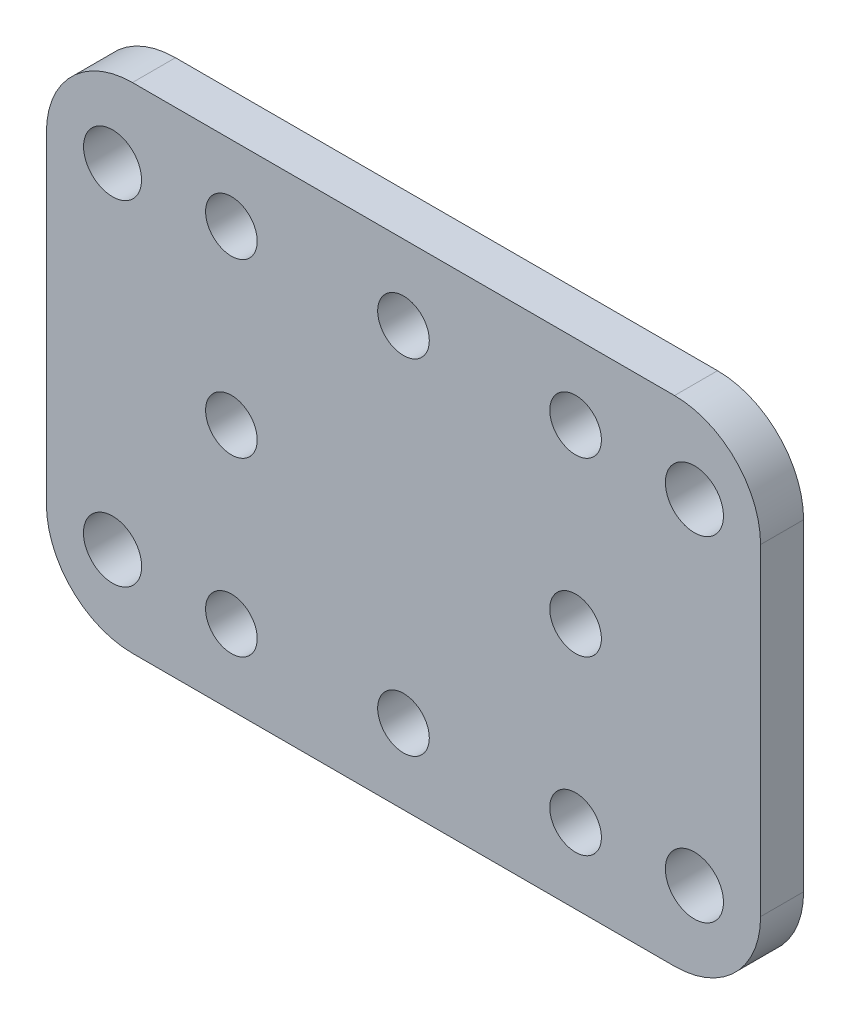
ISO-10303-21;
HEADER;
FILE_DESCRIPTION(('STEP AP214'),'2;1');
FILE_NAME('part.step','',(''),(''),'','','');
FILE_SCHEMA(('AUTOMOTIVE_DESIGN { 1 0 10303 214 1 1 1 1 }'));
ENDSEC;
DATA;
#1=APPLICATION_CONTEXT('core data for automotive mechanical design processes');
#2=APPLICATION_PROTOCOL_DEFINITION('international standard','automotive_design',2000,#1);
#3=PRODUCT_CONTEXT('',#1,'mechanical');
#4=PRODUCT('Part','Part','',(#3));
#5=PRODUCT_RELATED_PRODUCT_CATEGORY('part','',(#4));
#6=PRODUCT_DEFINITION_FORMATION('','',#4);
#7=PRODUCT_DEFINITION_CONTEXT('part definition',#1,'design');
#8=PRODUCT_DEFINITION('design','',#6,#7);
#9=PRODUCT_DEFINITION_SHAPE('','',#8);
#10=(LENGTH_UNIT() NAMED_UNIT(*) SI_UNIT(.MILLI.,.METRE.));
#11=(NAMED_UNIT(*) PLANE_ANGLE_UNIT() SI_UNIT($,.RADIAN.));
#12=(NAMED_UNIT(*) SI_UNIT($,.STERADIAN.) SOLID_ANGLE_UNIT());
#13=UNCERTAINTY_MEASURE_WITH_UNIT(LENGTH_MEASURE(1.E-05),#10,'distance_accuracy_value','');
#14=(GEOMETRIC_REPRESENTATION_CONTEXT(3) GLOBAL_UNCERTAINTY_ASSIGNED_CONTEXT((#13)) GLOBAL_UNIT_ASSIGNED_CONTEXT((#10,
#11,#12)) REPRESENTATION_CONTEXT('',''));
#15=CARTESIAN_POINT('',(0.,0.,0.));
#16=DIRECTION('',(0.,0.,1.));
#17=DIRECTION('',(1.,0.,0.));
#18=AXIS2_PLACEMENT_3D('',#15,#16,#17);
#19=CARTESIAN_POINT('',(-0.0106464534901096,23.1539046314824,2.));
#20=DIRECTION('',(1.,0.,0.));
#21=DIRECTION('',(0.,0.,-1.));
#22=AXIS2_PLACEMENT_3D('',#19,#20,#21);
#23=PLANE('',#22);
#24=DIRECTION('',(0.,-1.,0.));
#25=VECTOR('',#24,1.);
#26=CARTESIAN_POINT('',(-0.0106464534901096,23.1539046314824,0.));
#27=LINE('',#26,#25);
#28=CARTESIAN_POINT('',(-0.0106464534901096,19.1539046314824,0.));
#29=VERTEX_POINT('',#28);
#30=CARTESIAN_POINT('',(-0.0106464534901096,4.17558115471862,0.));
#31=VERTEX_POINT('',#30);
#32=EDGE_CURVE('E169',#29,#31,#27,.T.);
#33=ORIENTED_EDGE('',*,*,#32,.T.);
#34=DIRECTION('',(0.,0.,-1.));
#35=VECTOR('',#34,1.);
#36=CARTESIAN_POINT('',(-0.0106464534901096,4.17558115471862,2.));
#37=LINE('',#36,#35);
#38=CARTESIAN_POINT('',(-0.0106464534901096,4.17558115471862,2.));
#39=VERTEX_POINT('',#38);
#40=EDGE_CURVE('E54',#31,#39,#37,.F.);
#41=ORIENTED_EDGE('',*,*,#40,.T.);
#42=DIRECTION('',(0.,-1.,0.));
#43=VECTOR('',#42,1.);
#44=CARTESIAN_POINT('',(-0.0106464534901096,23.1539046314824,2.));
#45=LINE('',#44,#43);
#46=CARTESIAN_POINT('',(-0.0106464534901096,19.1539046314824,2.));
#47=VERTEX_POINT('',#46);
#48=EDGE_CURVE('E159',#47,#39,#45,.T.);
#49=ORIENTED_EDGE('',*,*,#48,.F.);
#50=DIRECTION('',(0.,0.,-1.));
#51=VECTOR('',#50,1.);
#52=CARTESIAN_POINT('',(-0.0106464534901096,19.1539046314824,0.));
#53=LINE('',#52,#51);
#54=EDGE_CURVE('E149',#47,#29,#53,.T.);
#55=ORIENTED_EDGE('',*,*,#54,.T.);
#56=EDGE_LOOP('',(#33,#41,#49,#55));
#57=FACE_BOUND('',#56,.T.);
#58=ADVANCED_FACE('F33',(#57),#23,.F.);
#59=CARTESIAN_POINT('',(-0.0106464534901096,0.175581154718624,2.));
#60=DIRECTION('',(0.,1.,0.));
#61=DIRECTION('',(0.,0.,1.));
#62=AXIS2_PLACEMENT_3D('',#59,#60,#61);
#63=PLANE('',#62);
#64=DIRECTION('',(1.,0.,0.));
#65=VECTOR('',#64,1.);
#66=CARTESIAN_POINT('',(-0.0106464534901096,0.175581154718624,2.));
#67=LINE('',#66,#65);
#68=CARTESIAN_POINT('',(3.98935354650989,0.175581154718624,2.));
#69=VERTEX_POINT('',#68);
#70=CARTESIAN_POINT('',(29.1903595716427,0.175581154718624,2.));
#71=VERTEX_POINT('',#70);
#72=EDGE_CURVE('E158',#69,#71,#67,.T.);
#73=ORIENTED_EDGE('',*,*,#72,.F.);
#74=DIRECTION('',(0.,0.,-1.));
#75=VECTOR('',#74,1.);
#76=CARTESIAN_POINT('',(3.98935354650989,0.175581154718624,2.));
#77=LINE('',#76,#75);
#78=CARTESIAN_POINT('',(3.98935354650989,0.175581154718624,0.));
#79=VERTEX_POINT('',#78);
#80=EDGE_CURVE('E142',#69,#79,#77,.T.);
#81=ORIENTED_EDGE('',*,*,#80,.T.);
#82=DIRECTION('',(1.,0.,0.));
#83=VECTOR('',#82,1.);
#84=CARTESIAN_POINT('',(-0.0106464534901096,0.175581154718624,0.));
#85=LINE('',#84,#83);
#86=CARTESIAN_POINT('',(29.1903595716427,0.175581154718624,0.));
#87=VERTEX_POINT('',#86);
#88=EDGE_CURVE('E120',#79,#87,#85,.T.);
#89=ORIENTED_EDGE('',*,*,#88,.T.);
#90=DIRECTION('',(0.,0.,-1.));
#91=VECTOR('',#90,1.);
#92=CARTESIAN_POINT('',(29.1903595716427,0.175581154718624,2.));
#93=LINE('',#92,#91);
#94=EDGE_CURVE('E134',#87,#71,#93,.F.);
#95=ORIENTED_EDGE('',*,*,#94,.T.);
#96=EDGE_LOOP('',(#73,#81,#89,#95));
#97=FACE_BOUND('',#96,.T.);
#98=ADVANCED_FACE('F163',(#97),#63,.F.);
#99=CARTESIAN_POINT('',(33.1903595716427,23.1539046314824,2.));
#100=DIRECTION('',(1.,0.,0.));
#101=DIRECTION('',(0.,0.,-1.));
#102=AXIS2_PLACEMENT_3D('',#99,#100,#101);
#103=PLANE('',#102);
#104=DIRECTION('',(0.,-1.,0.));
#105=VECTOR('',#104,1.);
#106=CARTESIAN_POINT('',(33.1903595716427,23.1539046314824,2.));
#107=LINE('',#106,#105);
#108=CARTESIAN_POINT('',(33.1903595716427,19.1539046314824,2.));
#109=VERTEX_POINT('',#108);
#110=CARTESIAN_POINT('',(33.1903595716427,4.17558115471862,2.));
#111=VERTEX_POINT('',#110);
#112=EDGE_CURVE('E129',#109,#111,#107,.T.);
#113=ORIENTED_EDGE('',*,*,#112,.T.);
#114=DIRECTION('',(0.,0.,-1.));
#115=VECTOR('',#114,1.);
#116=CARTESIAN_POINT('',(33.1903595716427,4.17558115471862,0.));
#117=LINE('',#116,#115);
#118=CARTESIAN_POINT('',(33.1903595716427,4.17558115471862,0.));
#119=VERTEX_POINT('',#118);
#120=EDGE_CURVE('E111',#111,#119,#117,.T.);
#121=ORIENTED_EDGE('',*,*,#120,.T.);
#122=DIRECTION('',(0.,-1.,0.));
#123=VECTOR('',#122,1.);
#124=CARTESIAN_POINT('',(33.1903595716427,23.1539046314824,0.));
#125=LINE('',#124,#123);
#126=CARTESIAN_POINT('',(33.1903595716427,19.1539046314824,0.));
#127=VERTEX_POINT('',#126);
#128=EDGE_CURVE('E104',#127,#119,#125,.T.);
#129=ORIENTED_EDGE('',*,*,#128,.F.);
#130=DIRECTION('',(0.,0.,-1.));
#131=VECTOR('',#130,1.);
#132=CARTESIAN_POINT('',(33.1903595716427,19.1539046314824,2.));
#133=LINE('',#132,#131);
#134=EDGE_CURVE('E117',#127,#109,#133,.F.);
#135=ORIENTED_EDGE('',*,*,#134,.T.);
#136=EDGE_LOOP('',(#113,#121,#129,#135));
#137=FACE_BOUND('',#136,.T.);
#138=ADVANCED_FACE('F116',(#137),#103,.T.);
#139=CARTESIAN_POINT('',(-0.0106464534901096,23.1539046314824,2.));
#140=DIRECTION('',(0.,1.,0.));
#141=DIRECTION('',(0.,0.,1.));
#142=AXIS2_PLACEMENT_3D('',#139,#140,#141);
#143=PLANE('',#142);
#144=DIRECTION('',(1.,0.,0.));
#145=VECTOR('',#144,1.);
#146=CARTESIAN_POINT('',(-0.0106464534901096,23.1539046314824,0.));
#147=LINE('',#146,#145);
#148=CARTESIAN_POINT('',(3.98935354650989,23.1539046314824,0.));
#149=VERTEX_POINT('',#148);
#150=CARTESIAN_POINT('',(29.1903595716427,23.1539046314824,0.));
#151=VERTEX_POINT('',#150);
#152=EDGE_CURVE('E105',#149,#151,#147,.T.);
#153=ORIENTED_EDGE('',*,*,#152,.F.);
#154=DIRECTION('',(0.,0.,-1.));
#155=VECTOR('',#154,1.);
#156=CARTESIAN_POINT('',(3.98935354650989,23.1539046314824,2.));
#157=LINE('',#156,#155);
#158=CARTESIAN_POINT('',(3.98935354650989,23.1539046314824,2.));
#159=VERTEX_POINT('',#158);
#160=EDGE_CURVE('E11',#149,#159,#157,.F.);
#161=ORIENTED_EDGE('',*,*,#160,.T.);
#162=DIRECTION('',(1.,0.,0.));
#163=VECTOR('',#162,1.);
#164=CARTESIAN_POINT('',(-0.0106464534901096,23.1539046314824,2.));
#165=LINE('',#164,#163);
#166=CARTESIAN_POINT('',(29.1903595716427,23.1539046314824,2.));
#167=VERTEX_POINT('',#166);
#168=EDGE_CURVE('E126',#159,#167,#165,.T.);
#169=ORIENTED_EDGE('',*,*,#168,.T.);
#170=DIRECTION('',(0.,0.,-1.));
#171=VECTOR('',#170,1.);
#172=CARTESIAN_POINT('',(29.1903595716427,23.1539046314824,2.));
#173=LINE('',#172,#171);
#174=EDGE_CURVE('E140',#167,#151,#173,.T.);
#175=ORIENTED_EDGE('',*,*,#174,.T.);
#176=EDGE_LOOP('',(#153,#161,#169,#175));
#177=FACE_BOUND('',#176,.T.);
#178=ADVANCED_FACE('F260',(#177),#143,.T.);
#179=CARTESIAN_POINT('',(0.,0.,2.));
#180=DIRECTION('',(0.,0.,1.));
#181=DIRECTION('',(1.,0.,0.));
#182=AXIS2_PLACEMENT_3D('',#179,#180,#181);
#183=PLANE('',#182);
#184=CARTESIAN_POINT('',(16.5898565590763,19.6647428931005,2.));
#185=DIRECTION('',(0.,0.,1.));
#186=DIRECTION('',(1.,0.,0.));
#187=AXIS2_PLACEMENT_3D('',#184,#185,#186);
#188=CIRCLE('',#187,1.2);
#189=CARTESIAN_POINT('',(17.7898565590763,19.6647428931005,2.));
#190=VERTEX_POINT('',#189);
#191=EDGE_CURVE('E243',#190,#190,#188,.T.);
#192=ORIENTED_EDGE('',*,*,#191,.F.);
#193=EDGE_LOOP('',(#192));
#194=FACE_BOUND('',#193,.T.);
#195=CARTESIAN_POINT('',(24.5898565590763,19.6647428931005,2.));
#196=DIRECTION('',(0.,0.,1.));
#197=DIRECTION('',(1.,0.,0.));
#198=AXIS2_PLACEMENT_3D('',#195,#196,#197);
#199=CIRCLE('',#198,1.2);
#200=CARTESIAN_POINT('',(25.7898565590763,19.6647428931005,2.));
#201=VERTEX_POINT('',#200);
#202=EDGE_CURVE('E237',#201,#201,#199,.T.);
#203=ORIENTED_EDGE('',*,*,#202,.F.);
#204=EDGE_LOOP('',(#203));
#205=FACE_BOUND('',#204,.T.);
#206=CARTESIAN_POINT('',(24.5898565590763,11.6647428931005,2.));
#207=DIRECTION('',(0.,0.,1.));
#208=DIRECTION('',(1.,0.,0.));
#209=AXIS2_PLACEMENT_3D('',#206,#207,#208);
#210=CIRCLE('',#209,1.2);
#211=CARTESIAN_POINT('',(25.7898565590763,11.6647428931005,2.));
#212=VERTEX_POINT('',#211);
#213=EDGE_CURVE('E231',#212,#212,#210,.T.);
#214=ORIENTED_EDGE('',*,*,#213,.F.);
#215=EDGE_LOOP('',(#214));
#216=FACE_BOUND('',#215,.T.);
#217=CARTESIAN_POINT('',(24.5898565590763,3.66474289310051,2.));
#218=DIRECTION('',(0.,0.,1.));
#219=DIRECTION('',(1.,0.,0.));
#220=AXIS2_PLACEMENT_3D('',#217,#218,#219);
#221=CIRCLE('',#220,1.2);
#222=CARTESIAN_POINT('',(25.7898565590763,3.66474289310051,2.));
#223=VERTEX_POINT('',#222);
#224=EDGE_CURVE('E225',#223,#223,#221,.T.);
#225=ORIENTED_EDGE('',*,*,#224,.F.);
#226=EDGE_LOOP('',(#225));
#227=FACE_BOUND('',#226,.T.);
#228=CARTESIAN_POINT('',(16.5898565590763,3.66474289310051,2.));
#229=DIRECTION('',(0.,0.,1.));
#230=DIRECTION('',(1.,0.,0.));
#231=AXIS2_PLACEMENT_3D('',#228,#229,#230);
#232=CIRCLE('',#231,1.2);
#233=CARTESIAN_POINT('',(17.7898565590763,3.66474289310051,2.));
#234=VERTEX_POINT('',#233);
#235=EDGE_CURVE('E219',#234,#234,#232,.T.);
#236=ORIENTED_EDGE('',*,*,#235,.F.);
#237=EDGE_LOOP('',(#236));
#238=FACE_BOUND('',#237,.T.);
#239=CARTESIAN_POINT('',(8.58985655907627,3.66474289310051,2.));
#240=DIRECTION('',(0.,0.,1.));
#241=DIRECTION('',(1.,0.,0.));
#242=AXIS2_PLACEMENT_3D('',#239,#240,#241);
#243=CIRCLE('',#242,1.2);
#244=CARTESIAN_POINT('',(9.78985655907627,3.66474289310051,2.));
#245=VERTEX_POINT('',#244);
#246=EDGE_CURVE('E213',#245,#245,#243,.T.);
#247=ORIENTED_EDGE('',*,*,#246,.F.);
#248=EDGE_LOOP('',(#247));
#249=FACE_BOUND('',#248,.T.);
#250=CARTESIAN_POINT('',(8.58985655907627,11.6647428931005,2.));
#251=DIRECTION('',(0.,0.,1.));
#252=DIRECTION('',(1.,0.,0.));
#253=AXIS2_PLACEMENT_3D('',#250,#251,#252);
#254=CIRCLE('',#253,1.2);
#255=CARTESIAN_POINT('',(9.78985655907627,11.6647428931005,2.));
#256=VERTEX_POINT('',#255);
#257=EDGE_CURVE('E207',#256,#256,#254,.T.);
#258=ORIENTED_EDGE('',*,*,#257,.F.);
#259=EDGE_LOOP('',(#258));
#260=FACE_BOUND('',#259,.T.);
#261=CARTESIAN_POINT('',(8.58985655907627,19.6647428931005,2.));
#262=DIRECTION('',(0.,0.,1.));
#263=DIRECTION('',(1.,0.,0.));
#264=AXIS2_PLACEMENT_3D('',#261,#262,#263);
#265=CIRCLE('',#264,1.2);
#266=CARTESIAN_POINT('',(9.78985655907627,19.6647428931005,2.));
#267=VERTEX_POINT('',#266);
#268=EDGE_CURVE('E201',#267,#267,#265,.T.);
#269=ORIENTED_EDGE('',*,*,#268,.F.);
#270=EDGE_LOOP('',(#269));
#271=FACE_BOUND('',#270,.T.);
#272=CARTESIAN_POINT('',(30.1147917816426,3.88806503066675,2.));
#273=DIRECTION('',(0.,0.,-1.));
#274=DIRECTION('',(-1.,0.,0.));
#275=AXIS2_PLACEMENT_3D('',#272,#273,#274);
#276=CIRCLE('',#275,1.34999999999999);
#277=CARTESIAN_POINT('',(28.7647917816427,3.88806503066675,2.));
#278=VERTEX_POINT('',#277);
#279=EDGE_CURVE('E192',#278,#278,#276,.T.);
#280=ORIENTED_EDGE('',*,*,#279,.T.);
#281=EDGE_LOOP('',(#280));
#282=FACE_BOUND('',#281,.T.);
#283=CARTESIAN_POINT('',(3.06492133650987,3.88806503066675,2.));
#284=DIRECTION('',(0.,0.,-1.));
#285=DIRECTION('',(-1.,0.,0.));
#286=AXIS2_PLACEMENT_3D('',#283,#284,#285);
#287=CIRCLE('',#286,1.35255456310899);
#288=CARTESIAN_POINT('',(1.71236677340089,3.88806503066675,2.));
#289=VERTEX_POINT('',#288);
#290=EDGE_CURVE('E186',#289,#289,#287,.T.);
#291=ORIENTED_EDGE('',*,*,#290,.T.);
#292=EDGE_LOOP('',(#291));
#293=FACE_BOUND('',#292,.T.);
#294=CARTESIAN_POINT('',(3.06492133546274,19.4414207555343,2.));
#295=DIRECTION('',(0.,0.,-1.));
#296=DIRECTION('',(-1.,0.,0.));
#297=AXIS2_PLACEMENT_3D('',#294,#295,#296);
#298=CIRCLE('',#297,1.3478681923342);
#299=CARTESIAN_POINT('',(1.71705314312854,19.4414207555343,2.));
#300=VERTEX_POINT('',#299);
#301=EDGE_CURVE('E181',#300,#300,#298,.T.);
#302=ORIENTED_EDGE('',*,*,#301,.T.);
#303=EDGE_LOOP('',(#302));
#304=FACE_BOUND('',#303,.T.);
#305=CARTESIAN_POINT('',(30.1147917816427,19.4414207574783,2.));
#306=DIRECTION('',(0.,0.,-1.));
#307=DIRECTION('',(-1.,0.,0.));
#308=AXIS2_PLACEMENT_3D('',#305,#306,#307);
#309=CIRCLE('',#308,1.34999999999999);
#310=CARTESIAN_POINT('',(28.7647917816427,19.4414207574783,2.));
#311=VERTEX_POINT('',#310);
#312=EDGE_CURVE('E171',#311,#311,#309,.T.);
#313=ORIENTED_EDGE('',*,*,#312,.T.);
#314=EDGE_LOOP('',(#313));
#315=FACE_BOUND('',#314,.T.);
#316=ORIENTED_EDGE('',*,*,#48,.T.);
#317=CARTESIAN_POINT('',(3.98935354650989,4.17558115471862,2.));
#318=DIRECTION('',(0.,0.,1.));
#319=DIRECTION('',(1.,0.,0.));
#320=AXIS2_PLACEMENT_3D('',#317,#318,#319);
#321=CIRCLE('',#320,4.);
#322=EDGE_CURVE('E41',#39,#69,#321,.T.);
#323=ORIENTED_EDGE('',*,*,#322,.T.);
#324=ORIENTED_EDGE('',*,*,#72,.T.);
#325=CARTESIAN_POINT('',(29.1903595716427,4.17558115471862,2.));
#326=DIRECTION('',(0.,0.,1.));
#327=DIRECTION('',(1.,0.,0.));
#328=AXIS2_PLACEMENT_3D('',#325,#326,#327);
#329=CIRCLE('',#328,4.);
#330=EDGE_CURVE('E138',#71,#111,#329,.T.);
#331=ORIENTED_EDGE('',*,*,#330,.T.);
#332=ORIENTED_EDGE('',*,*,#112,.F.);
#333=CARTESIAN_POINT('',(29.1903595716427,19.1539046314824,2.));
#334=DIRECTION('',(0.,0.,1.));
#335=DIRECTION('',(1.,0.,0.));
#336=AXIS2_PLACEMENT_3D('',#333,#334,#335);
#337=CIRCLE('',#336,4.);
#338=EDGE_CURVE('E125',#109,#167,#337,.T.);
#339=ORIENTED_EDGE('',*,*,#338,.T.);
#340=ORIENTED_EDGE('',*,*,#168,.F.);
#341=CARTESIAN_POINT('',(3.98935354650989,19.1539046314824,2.));
#342=DIRECTION('',(0.,0.,1.));
#343=DIRECTION('',(1.,0.,0.));
#344=AXIS2_PLACEMENT_3D('',#341,#342,#343);
#345=CIRCLE('',#344,4.);
#346=EDGE_CURVE('E153',#159,#47,#345,.T.);
#347=ORIENTED_EDGE('',*,*,#346,.T.);
#348=EDGE_LOOP('',(#316,#323,#324,#331,#332,#339,#340,#347));
#349=FACE_BOUND('',#348,.T.);
#350=ADVANCED_FACE('F157',(#194,#205,#216,#227,#238,#249,#260,#271,#282,#293,#304,#315,#349),
#183,.T.);
#351=CARTESIAN_POINT('',(0.,0.,0.));
#352=DIRECTION('',(0.,0.,1.));
#353=DIRECTION('',(1.,0.,0.));
#354=AXIS2_PLACEMENT_3D('',#351,#352,#353);
#355=PLANE('',#354);
#356=CARTESIAN_POINT('',(16.5898565590763,19.6647428931005,0.));
#357=DIRECTION('',(0.,0.,1.));
#358=DIRECTION('',(1.,0.,0.));
#359=AXIS2_PLACEMENT_3D('',#356,#357,#358);
#360=CIRCLE('',#359,1.2);
#361=CARTESIAN_POINT('',(17.7898565590763,19.6647428931005,0.));
#362=VERTEX_POINT('',#361);
#363=EDGE_CURVE('E240',#362,#362,#360,.T.);
#364=ORIENTED_EDGE('',*,*,#363,.T.);
#365=EDGE_LOOP('',(#364));
#366=FACE_BOUND('',#365,.T.);
#367=CARTESIAN_POINT('',(24.5898565590763,19.6647428931005,0.));
#368=DIRECTION('',(0.,0.,1.));
#369=DIRECTION('',(1.,0.,0.));
#370=AXIS2_PLACEMENT_3D('',#367,#368,#369);
#371=CIRCLE('',#370,1.2);
#372=CARTESIAN_POINT('',(25.7898565590763,19.6647428931005,0.));
#373=VERTEX_POINT('',#372);
#374=EDGE_CURVE('E234',#373,#373,#371,.T.);
#375=ORIENTED_EDGE('',*,*,#374,.T.);
#376=EDGE_LOOP('',(#375));
#377=FACE_BOUND('',#376,.T.);
#378=CARTESIAN_POINT('',(24.5898565590763,11.6647428931005,0.));
#379=DIRECTION('',(0.,0.,1.));
#380=DIRECTION('',(1.,0.,0.));
#381=AXIS2_PLACEMENT_3D('',#378,#379,#380);
#382=CIRCLE('',#381,1.2);
#383=CARTESIAN_POINT('',(25.7898565590763,11.6647428931005,0.));
#384=VERTEX_POINT('',#383);
#385=EDGE_CURVE('E228',#384,#384,#382,.T.);
#386=ORIENTED_EDGE('',*,*,#385,.T.);
#387=EDGE_LOOP('',(#386));
#388=FACE_BOUND('',#387,.T.);
#389=CARTESIAN_POINT('',(24.5898565590763,3.66474289310051,0.));
#390=DIRECTION('',(0.,0.,1.));
#391=DIRECTION('',(1.,0.,0.));
#392=AXIS2_PLACEMENT_3D('',#389,#390,#391);
#393=CIRCLE('',#392,1.2);
#394=CARTESIAN_POINT('',(25.7898565590763,3.66474289310051,0.));
#395=VERTEX_POINT('',#394);
#396=EDGE_CURVE('E222',#395,#395,#393,.T.);
#397=ORIENTED_EDGE('',*,*,#396,.T.);
#398=EDGE_LOOP('',(#397));
#399=FACE_BOUND('',#398,.T.);
#400=CARTESIAN_POINT('',(16.5898565590763,3.66474289310051,0.));
#401=DIRECTION('',(0.,0.,1.));
#402=DIRECTION('',(1.,0.,0.));
#403=AXIS2_PLACEMENT_3D('',#400,#401,#402);
#404=CIRCLE('',#403,1.2);
#405=CARTESIAN_POINT('',(17.7898565590763,3.66474289310051,0.));
#406=VERTEX_POINT('',#405);
#407=EDGE_CURVE('E216',#406,#406,#404,.T.);
#408=ORIENTED_EDGE('',*,*,#407,.T.);
#409=EDGE_LOOP('',(#408));
#410=FACE_BOUND('',#409,.T.);
#411=CARTESIAN_POINT('',(8.58985655907627,3.66474289310051,0.));
#412=DIRECTION('',(0.,0.,1.));
#413=DIRECTION('',(1.,0.,0.));
#414=AXIS2_PLACEMENT_3D('',#411,#412,#413);
#415=CIRCLE('',#414,1.2);
#416=CARTESIAN_POINT('',(9.78985655907627,3.66474289310051,0.));
#417=VERTEX_POINT('',#416);
#418=EDGE_CURVE('E210',#417,#417,#415,.T.);
#419=ORIENTED_EDGE('',*,*,#418,.T.);
#420=EDGE_LOOP('',(#419));
#421=FACE_BOUND('',#420,.T.);
#422=CARTESIAN_POINT('',(8.58985655907627,11.6647428931005,0.));
#423=DIRECTION('',(0.,0.,1.));
#424=DIRECTION('',(1.,0.,0.));
#425=AXIS2_PLACEMENT_3D('',#422,#423,#424);
#426=CIRCLE('',#425,1.2);
#427=CARTESIAN_POINT('',(9.78985655907627,11.6647428931005,0.));
#428=VERTEX_POINT('',#427);
#429=EDGE_CURVE('E204',#428,#428,#426,.T.);
#430=ORIENTED_EDGE('',*,*,#429,.T.);
#431=EDGE_LOOP('',(#430));
#432=FACE_BOUND('',#431,.T.);
#433=CARTESIAN_POINT('',(8.58985655907627,19.6647428931005,0.));
#434=DIRECTION('',(0.,0.,1.));
#435=DIRECTION('',(1.,0.,0.));
#436=AXIS2_PLACEMENT_3D('',#433,#434,#435);
#437=CIRCLE('',#436,1.2);
#438=CARTESIAN_POINT('',(9.78985655907627,19.6647428931005,0.));
#439=VERTEX_POINT('',#438);
#440=EDGE_CURVE('E198',#439,#439,#437,.T.);
#441=ORIENTED_EDGE('',*,*,#440,.T.);
#442=EDGE_LOOP('',(#441));
#443=FACE_BOUND('',#442,.T.);
#444=CARTESIAN_POINT('',(30.1147917816426,3.88806503066675,0.));
#445=DIRECTION('',(0.,0.,-1.));
#446=DIRECTION('',(-1.,0.,0.));
#447=AXIS2_PLACEMENT_3D('',#444,#445,#446);
#448=CIRCLE('',#447,1.34999999999999);
#449=CARTESIAN_POINT('',(28.7647917816427,3.88806503066675,0.));
#450=VERTEX_POINT('',#449);
#451=EDGE_CURVE('E195',#450,#450,#448,.T.);
#452=ORIENTED_EDGE('',*,*,#451,.F.);
#453=EDGE_LOOP('',(#452));
#454=FACE_BOUND('',#453,.T.);
#455=CARTESIAN_POINT('',(3.06492133650987,3.88806503066675,0.));
#456=DIRECTION('',(0.,0.,-1.));
#457=DIRECTION('',(-1.,0.,0.));
#458=AXIS2_PLACEMENT_3D('',#455,#456,#457);
#459=CIRCLE('',#458,1.35255456310899);
#460=CARTESIAN_POINT('',(1.71236677340089,3.88806503066675,0.));
#461=VERTEX_POINT('',#460);
#462=EDGE_CURVE('E189',#461,#461,#459,.T.);
#463=ORIENTED_EDGE('',*,*,#462,.F.);
#464=EDGE_LOOP('',(#463));
#465=FACE_BOUND('',#464,.T.);
#466=CARTESIAN_POINT('',(3.06492133546274,19.4414207555343,0.));
#467=DIRECTION('',(0.,0.,-1.));
#468=DIRECTION('',(-1.,0.,0.));
#469=AXIS2_PLACEMENT_3D('',#466,#467,#468);
#470=CIRCLE('',#469,1.3478681923342);
#471=CARTESIAN_POINT('',(1.71705314312854,19.4414207555343,0.));
#472=VERTEX_POINT('',#471);
#473=EDGE_CURVE('E183',#472,#472,#470,.T.);
#474=ORIENTED_EDGE('',*,*,#473,.F.);
#475=EDGE_LOOP('',(#474));
#476=FACE_BOUND('',#475,.T.);
#477=CARTESIAN_POINT('',(30.1147917816427,19.4414207574783,0.));
#478=DIRECTION('',(0.,0.,-1.));
#479=DIRECTION('',(-1.,0.,0.));
#480=AXIS2_PLACEMENT_3D('',#477,#478,#479);
#481=CIRCLE('',#480,1.34999999999999);
#482=CARTESIAN_POINT('',(28.7647917816427,19.4414207574783,0.));
#483=VERTEX_POINT('',#482);
#484=EDGE_CURVE('E175',#483,#483,#481,.T.);
#485=ORIENTED_EDGE('',*,*,#484,.F.);
#486=EDGE_LOOP('',(#485));
#487=FACE_BOUND('',#486,.T.);
#488=ORIENTED_EDGE('',*,*,#88,.F.);
#489=CARTESIAN_POINT('',(3.98935354650989,4.17558115471862,0.));
#490=DIRECTION('',(0.,0.,1.));
#491=DIRECTION('',(1.,0.,0.));
#492=AXIS2_PLACEMENT_3D('',#489,#490,#491);
#493=CIRCLE('',#492,4.);
#494=EDGE_CURVE('E147',#79,#31,#493,.F.);
#495=ORIENTED_EDGE('',*,*,#494,.T.);
#496=ORIENTED_EDGE('',*,*,#32,.F.);
#497=CARTESIAN_POINT('',(3.98935354650989,19.1539046314824,0.));
#498=DIRECTION('',(0.,0.,1.));
#499=DIRECTION('',(1.,0.,0.));
#500=AXIS2_PLACEMENT_3D('',#497,#498,#499);
#501=CIRCLE('',#500,4.);
#502=EDGE_CURVE('E145',#29,#149,#501,.F.);
#503=ORIENTED_EDGE('',*,*,#502,.T.);
#504=ORIENTED_EDGE('',*,*,#152,.T.);
#505=CARTESIAN_POINT('',(29.1903595716427,19.1539046314824,0.));
#506=DIRECTION('',(0.,0.,1.));
#507=DIRECTION('',(1.,0.,0.));
#508=AXIS2_PLACEMENT_3D('',#505,#506,#507);
#509=CIRCLE('',#508,4.);
#510=EDGE_CURVE('E99',#151,#127,#509,.F.);
#511=ORIENTED_EDGE('',*,*,#510,.T.);
#512=ORIENTED_EDGE('',*,*,#128,.T.);
#513=CARTESIAN_POINT('',(29.1903595716427,4.17558115471862,0.));
#514=DIRECTION('',(0.,0.,1.));
#515=DIRECTION('',(1.,0.,0.));
#516=AXIS2_PLACEMENT_3D('',#513,#514,#515);
#517=CIRCLE('',#516,4.);
#518=EDGE_CURVE('E110',#119,#87,#517,.F.);
#519=ORIENTED_EDGE('',*,*,#518,.T.);
#520=EDGE_LOOP('',(#488,#495,#496,#503,#504,#511,#512,#519));
#521=FACE_BOUND('',#520,.T.);
#522=ADVANCED_FACE('F102',(#366,#377,#388,#399,#410,#421,#432,#443,#454,#465,#476,#487,#521),
#355,.F.);
#523=CARTESIAN_POINT('',(30.1147917816427,19.4414207574783,2.));
#524=DIRECTION('',(0.,0.,-1.));
#525=DIRECTION('',(-1.,0.,0.));
#526=AXIS2_PLACEMENT_3D('',#523,#524,#525);
#527=CYLINDRICAL_SURFACE('',#526,1.34999999999999);
#528=ORIENTED_EDGE('',*,*,#312,.F.);
#529=EDGE_LOOP('',(#528));
#530=FACE_BOUND('',#529,.T.);
#531=ORIENTED_EDGE('',*,*,#484,.T.);
#532=EDGE_LOOP('',(#531));
#533=FACE_BOUND('',#532,.T.);
#534=ADVANCED_FACE('F284',(#530,#533),#527,.F.);
#535=CARTESIAN_POINT('',(3.06492133546274,19.4414207555343,2.));
#536=DIRECTION('',(0.,0.,-1.));
#537=DIRECTION('',(-1.,0.,0.));
#538=AXIS2_PLACEMENT_3D('',#535,#536,#537);
#539=CYLINDRICAL_SURFACE('',#538,1.3478681923342);
#540=ORIENTED_EDGE('',*,*,#301,.F.);
#541=EDGE_LOOP('',(#540));
#542=FACE_BOUND('',#541,.T.);
#543=ORIENTED_EDGE('',*,*,#473,.T.);
#544=EDGE_LOOP('',(#543));
#545=FACE_BOUND('',#544,.T.);
#546=ADVANCED_FACE('F287',(#542,#545),#539,.F.);
#547=CARTESIAN_POINT('',(3.06492133650987,3.88806503066675,2.));
#548=DIRECTION('',(0.,0.,-1.));
#549=DIRECTION('',(-1.,0.,0.));
#550=AXIS2_PLACEMENT_3D('',#547,#548,#549);
#551=CYLINDRICAL_SURFACE('',#550,1.35255456310899);
#552=ORIENTED_EDGE('',*,*,#290,.F.);
#553=EDGE_LOOP('',(#552));
#554=FACE_BOUND('',#553,.T.);
#555=ORIENTED_EDGE('',*,*,#462,.T.);
#556=EDGE_LOOP('',(#555));
#557=FACE_BOUND('',#556,.T.);
#558=ADVANCED_FACE('F441',(#554,#557),#551,.F.);
#559=CARTESIAN_POINT('',(30.1147917816426,3.88806503066675,2.));
#560=DIRECTION('',(0.,0.,-1.));
#561=DIRECTION('',(-1.,0.,0.));
#562=AXIS2_PLACEMENT_3D('',#559,#560,#561);
#563=CYLINDRICAL_SURFACE('',#562,1.34999999999999);
#564=ORIENTED_EDGE('',*,*,#279,.F.);
#565=EDGE_LOOP('',(#564));
#566=FACE_BOUND('',#565,.T.);
#567=ORIENTED_EDGE('',*,*,#451,.T.);
#568=EDGE_LOOP('',(#567));
#569=FACE_BOUND('',#568,.T.);
#570=ADVANCED_FACE('F307',(#566,#569),#563,.F.);
#571=CARTESIAN_POINT('',(29.1903595716427,4.17558115471862,2.));
#572=DIRECTION('',(0.,0.,1.));
#573=DIRECTION('',(1.,0.,0.));
#574=AXIS2_PLACEMENT_3D('',#571,#572,#573);
#575=CYLINDRICAL_SURFACE('',#574,4.);
#576=ORIENTED_EDGE('',*,*,#330,.F.);
#577=ORIENTED_EDGE('',*,*,#94,.F.);
#578=ORIENTED_EDGE('',*,*,#518,.F.);
#579=ORIENTED_EDGE('',*,*,#120,.F.);
#580=EDGE_LOOP('',(#576,#577,#578,#579));
#581=FACE_BOUND('',#580,.T.);
#582=ADVANCED_FACE('F304',(#581),#575,.T.);
#583=CARTESIAN_POINT('',(29.1903595716427,19.1539046314824,2.));
#584=DIRECTION('',(0.,0.,-1.));
#585=DIRECTION('',(-1.,0.,0.));
#586=AXIS2_PLACEMENT_3D('',#583,#584,#585);
#587=CYLINDRICAL_SURFACE('',#586,4.);
#588=ORIENTED_EDGE('',*,*,#338,.F.);
#589=ORIENTED_EDGE('',*,*,#134,.F.);
#590=ORIENTED_EDGE('',*,*,#510,.F.);
#591=ORIENTED_EDGE('',*,*,#174,.F.);
#592=EDGE_LOOP('',(#588,#589,#590,#591));
#593=FACE_BOUND('',#592,.T.);
#594=ADVANCED_FACE('F123',(#593),#587,.T.);
#595=CARTESIAN_POINT('',(3.98935354650989,4.17558115471862,2.));
#596=DIRECTION('',(0.,0.,-1.));
#597=DIRECTION('',(-1.,0.,0.));
#598=AXIS2_PLACEMENT_3D('',#595,#596,#597);
#599=CYLINDRICAL_SURFACE('',#598,4.);
#600=ORIENTED_EDGE('',*,*,#322,.F.);
#601=ORIENTED_EDGE('',*,*,#40,.F.);
#602=ORIENTED_EDGE('',*,*,#494,.F.);
#603=ORIENTED_EDGE('',*,*,#80,.F.);
#604=EDGE_LOOP('',(#600,#601,#602,#603));
#605=FACE_BOUND('',#604,.T.);
#606=ADVANCED_FACE('F167',(#605),#599,.T.);
#607=CARTESIAN_POINT('',(3.98935354650989,19.1539046314824,2.));
#608=DIRECTION('',(0.,0.,1.));
#609=DIRECTION('',(1.,0.,0.));
#610=AXIS2_PLACEMENT_3D('',#607,#608,#609);
#611=CYLINDRICAL_SURFACE('',#610,4.);
#612=ORIENTED_EDGE('',*,*,#346,.F.);
#613=ORIENTED_EDGE('',*,*,#160,.F.);
#614=ORIENTED_EDGE('',*,*,#502,.F.);
#615=ORIENTED_EDGE('',*,*,#54,.F.);
#616=EDGE_LOOP('',(#612,#613,#614,#615));
#617=FACE_BOUND('',#616,.T.);
#618=ADVANCED_FACE('F35',(#617),#611,.T.);
#619=CARTESIAN_POINT('',(8.58985655907627,19.6647428931005,0.));
#620=DIRECTION('',(0.,0.,1.));
#621=DIRECTION('',(1.,0.,0.));
#622=AXIS2_PLACEMENT_3D('',#619,#620,#621);
#623=CYLINDRICAL_SURFACE('',#622,1.2);
#624=ORIENTED_EDGE('',*,*,#440,.F.);
#625=EDGE_LOOP('',(#624));
#626=FACE_BOUND('',#625,.T.);
#627=ORIENTED_EDGE('',*,*,#268,.T.);
#628=EDGE_LOOP('',(#627));
#629=FACE_BOUND('',#628,.T.);
#630=ADVANCED_FACE('F314',(#626,#629),#623,.F.);
#631=CARTESIAN_POINT('',(8.58985655907627,11.6647428931005,0.));
#632=DIRECTION('',(0.,0.,1.));
#633=DIRECTION('',(1.,0.,0.));
#634=AXIS2_PLACEMENT_3D('',#631,#632,#633);
#635=CYLINDRICAL_SURFACE('',#634,1.2);
#636=ORIENTED_EDGE('',*,*,#429,.F.);
#637=EDGE_LOOP('',(#636));
#638=FACE_BOUND('',#637,.T.);
#639=ORIENTED_EDGE('',*,*,#257,.T.);
#640=EDGE_LOOP('',(#639));
#641=FACE_BOUND('',#640,.T.);
#642=ADVANCED_FACE('F319',(#638,#641),#635,.F.);
#643=CARTESIAN_POINT('',(8.58985655907627,3.66474289310051,0.));
#644=DIRECTION('',(0.,0.,1.));
#645=DIRECTION('',(1.,0.,0.));
#646=AXIS2_PLACEMENT_3D('',#643,#644,#645);
#647=CYLINDRICAL_SURFACE('',#646,1.2);
#648=ORIENTED_EDGE('',*,*,#418,.F.);
#649=EDGE_LOOP('',(#648));
#650=FACE_BOUND('',#649,.T.);
#651=ORIENTED_EDGE('',*,*,#246,.T.);
#652=EDGE_LOOP('',(#651));
#653=FACE_BOUND('',#652,.T.);
#654=ADVANCED_FACE('F377',(#650,#653),#647,.F.);
#655=CARTESIAN_POINT('',(16.5898565590763,3.66474289310051,0.));
#656=DIRECTION('',(0.,0.,1.));
#657=DIRECTION('',(1.,0.,0.));
#658=AXIS2_PLACEMENT_3D('',#655,#656,#657);
#659=CYLINDRICAL_SURFACE('',#658,1.2);
#660=ORIENTED_EDGE('',*,*,#407,.F.);
#661=EDGE_LOOP('',(#660));
#662=FACE_BOUND('',#661,.T.);
#663=ORIENTED_EDGE('',*,*,#235,.T.);
#664=EDGE_LOOP('',(#663));
#665=FACE_BOUND('',#664,.T.);
#666=ADVANCED_FACE('F387',(#662,#665),#659,.F.);
#667=CARTESIAN_POINT('',(24.5898565590763,3.66474289310051,0.));
#668=DIRECTION('',(0.,0.,1.));
#669=DIRECTION('',(1.,0.,0.));
#670=AXIS2_PLACEMENT_3D('',#667,#668,#669);
#671=CYLINDRICAL_SURFACE('',#670,1.2);
#672=ORIENTED_EDGE('',*,*,#396,.F.);
#673=EDGE_LOOP('',(#672));
#674=FACE_BOUND('',#673,.T.);
#675=ORIENTED_EDGE('',*,*,#224,.T.);
#676=EDGE_LOOP('',(#675));
#677=FACE_BOUND('',#676,.T.);
#678=ADVANCED_FACE('F397',(#674,#677),#671,.F.);
#679=CARTESIAN_POINT('',(24.5898565590763,11.6647428931005,0.));
#680=DIRECTION('',(0.,0.,1.));
#681=DIRECTION('',(1.,0.,0.));
#682=AXIS2_PLACEMENT_3D('',#679,#680,#681);
#683=CYLINDRICAL_SURFACE('',#682,1.2);
#684=ORIENTED_EDGE('',*,*,#385,.F.);
#685=EDGE_LOOP('',(#684));
#686=FACE_BOUND('',#685,.T.);
#687=ORIENTED_EDGE('',*,*,#213,.T.);
#688=EDGE_LOOP('',(#687));
#689=FACE_BOUND('',#688,.T.);
#690=ADVANCED_FACE('F407',(#686,#689),#683,.F.);
#691=CARTESIAN_POINT('',(24.5898565590763,19.6647428931005,0.));
#692=DIRECTION('',(0.,0.,1.));
#693=DIRECTION('',(1.,0.,0.));
#694=AXIS2_PLACEMENT_3D('',#691,#692,#693);
#695=CYLINDRICAL_SURFACE('',#694,1.2);
#696=ORIENTED_EDGE('',*,*,#374,.F.);
#697=EDGE_LOOP('',(#696));
#698=FACE_BOUND('',#697,.T.);
#699=ORIENTED_EDGE('',*,*,#202,.T.);
#700=EDGE_LOOP('',(#699));
#701=FACE_BOUND('',#700,.T.);
#702=ADVANCED_FACE('F254',(#698,#701),#695,.F.);
#703=CARTESIAN_POINT('',(16.5898565590763,19.6647428931005,0.));
#704=DIRECTION('',(0.,0.,1.));
#705=DIRECTION('',(1.,0.,0.));
#706=AXIS2_PLACEMENT_3D('',#703,#704,#705);
#707=CYLINDRICAL_SURFACE('',#706,1.2);
#708=ORIENTED_EDGE('',*,*,#363,.F.);
#709=EDGE_LOOP('',(#708));
#710=FACE_BOUND('',#709,.T.);
#711=ORIENTED_EDGE('',*,*,#191,.T.);
#712=EDGE_LOOP('',(#711));
#713=FACE_BOUND('',#712,.T.);
#714=ADVANCED_FACE('F251',(#710,#713),#707,.F.);
#715=CLOSED_SHELL('',(#58,#98,#138,#178,#350,#522,#534,#546,#558,#570,#582,#594,#606,#618,#630,
#642,#654,#666,#678,#690,#702,#714));
#716=MANIFOLD_SOLID_BREP('B2',#715);
#717=ADVANCED_BREP_SHAPE_REPRESENTATION('',(#18,#716),#14);
#718=SHAPE_DEFINITION_REPRESENTATION(#9,#717);
ENDSEC;
END-ISO-10303-21;
